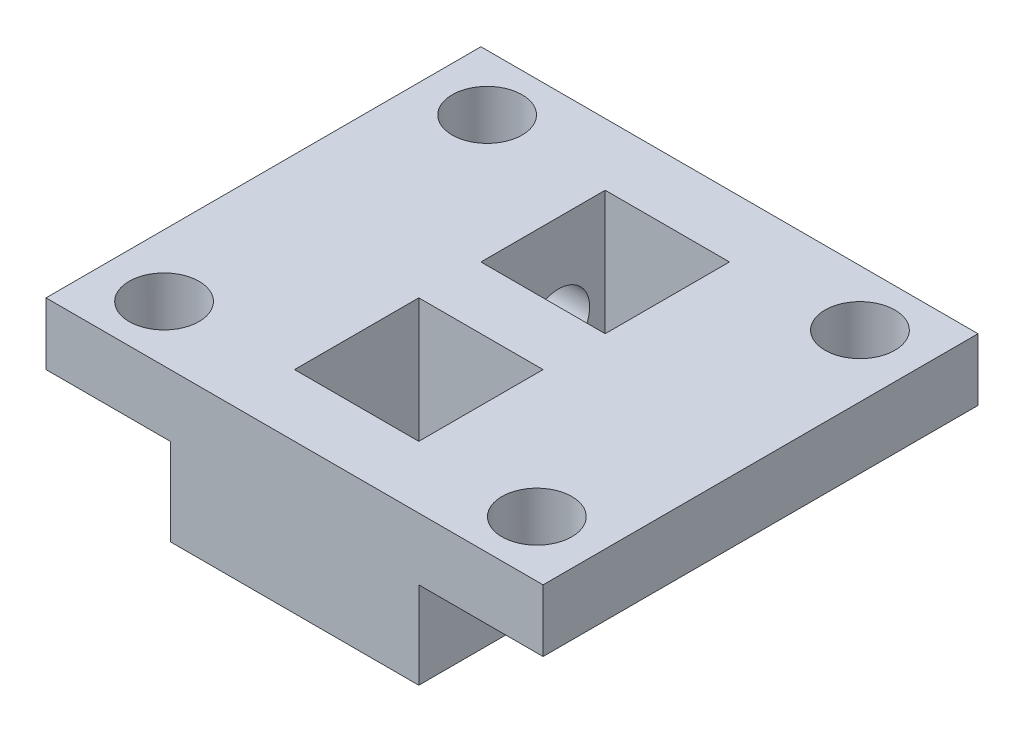
ISO-10303-21;
HEADER;
FILE_DESCRIPTION(('STEP AP214'),'2;1');
FILE_NAME('part.step','',(''),(''),'','','');
FILE_SCHEMA(('AUTOMOTIVE_DESIGN { 1 0 10303 214 1 1 1 1 }'));
ENDSEC;
DATA;
#1=APPLICATION_CONTEXT('core data for automotive mechanical design processes');
#2=APPLICATION_PROTOCOL_DEFINITION('international standard','automotive_design',2000,#1);
#3=PRODUCT_CONTEXT('',#1,'mechanical');
#4=PRODUCT('Part','Part','',(#3));
#5=PRODUCT_RELATED_PRODUCT_CATEGORY('part','',(#4));
#6=PRODUCT_DEFINITION_FORMATION('','',#4);
#7=PRODUCT_DEFINITION_CONTEXT('part definition',#1,'design');
#8=PRODUCT_DEFINITION('design','',#6,#7);
#9=PRODUCT_DEFINITION_SHAPE('','',#8);
#10=(LENGTH_UNIT() NAMED_UNIT(*) SI_UNIT(.MILLI.,.METRE.));
#11=(NAMED_UNIT(*) PLANE_ANGLE_UNIT() SI_UNIT($,.RADIAN.));
#12=(NAMED_UNIT(*) SI_UNIT($,.STERADIAN.) SOLID_ANGLE_UNIT());
#13=UNCERTAINTY_MEASURE_WITH_UNIT(LENGTH_MEASURE(1.E-05),#10,'distance_accuracy_value','');
#14=(GEOMETRIC_REPRESENTATION_CONTEXT(3) GLOBAL_UNCERTAINTY_ASSIGNED_CONTEXT((#13)) GLOBAL_UNIT_ASSIGNED_CONTEXT((#10,
#11,#12)) REPRESENTATION_CONTEXT('',''));
#15=CARTESIAN_POINT('',(0.,0.,0.));
#16=DIRECTION('',(0.,0.,1.));
#17=DIRECTION('',(1.,0.,0.));
#18=AXIS2_PLACEMENT_3D('',#15,#16,#17);
#19=CARTESIAN_POINT('',(6.35,0.,11.1125));
#20=DIRECTION('',(0.,-1.,0.));
#21=DIRECTION('',(1.,0.,0.));
#22=AXIS2_PLACEMENT_3D('',#19,#20,#21);
#23=PLANE('',#22);
#24=DIRECTION('',(-1.,0.,0.));
#25=VECTOR('',#24,1.);
#26=CARTESIAN_POINT('',(6.35,0.,0.));
#27=LINE('',#26,#25);
#28=CARTESIAN_POINT('',(6.35,0.,0.));
#29=VERTEX_POINT('',#28);
#30=CARTESIAN_POINT('',(-6.35,0.,0.));
#31=VERTEX_POINT('',#30);
#32=EDGE_CURVE('E279',#29,#31,#27,.T.);
#33=ORIENTED_EDGE('',*,*,#32,.F.);
#34=DIRECTION('',(0.,0.,-1.));
#35=VECTOR('',#34,1.);
#36=CARTESIAN_POINT('',(6.35,0.,11.1125));
#37=LINE('',#36,#35);
#38=CARTESIAN_POINT('',(6.35,0.,22.225));
#39=VERTEX_POINT('',#38);
#40=EDGE_CURVE('E12',#39,#29,#37,.T.);
#41=ORIENTED_EDGE('',*,*,#40,.F.);
#42=DIRECTION('',(-1.,0.,0.));
#43=VECTOR('',#42,1.);
#44=CARTESIAN_POINT('',(6.35,0.,22.225));
#45=LINE('',#44,#43);
#46=CARTESIAN_POINT('',(-6.35,0.,22.225));
#47=VERTEX_POINT('',#46);
#48=EDGE_CURVE('E205',#39,#47,#45,.T.);
#49=ORIENTED_EDGE('',*,*,#48,.T.);
#50=DIRECTION('',(0.,0.,-1.));
#51=VECTOR('',#50,1.);
#52=CARTESIAN_POINT('',(-6.35,0.,11.1125));
#53=LINE('',#52,#51);
#54=EDGE_CURVE('E276',#47,#31,#53,.T.);
#55=ORIENTED_EDGE('',*,*,#54,.T.);
#56=EDGE_LOOP('',(#33,#41,#49,#55));
#57=FACE_BOUND('',#56,.T.);
#58=ADVANCED_FACE('F35',(#57),#23,.T.);
#59=CARTESIAN_POINT('',(6.35,4.445,11.1125));
#60=DIRECTION('',(1.,0.,0.));
#61=DIRECTION('',(0.,1.,0.));
#62=AXIS2_PLACEMENT_3D('',#59,#60,#61);
#63=PLANE('',#62);
#64=DIRECTION('',(0.,-1.,0.));
#65=VECTOR('',#64,1.);
#66=CARTESIAN_POINT('',(6.35,4.445,0.));
#67=LINE('',#66,#65);
#68=CARTESIAN_POINT('',(6.35,4.445,0.));
#69=VERTEX_POINT('',#68);
#70=EDGE_CURVE('E299',#69,#29,#67,.T.);
#71=ORIENTED_EDGE('',*,*,#70,.F.);
#72=DIRECTION('',(0.,0.,-1.));
#73=VECTOR('',#72,1.);
#74=CARTESIAN_POINT('',(6.35,4.445,11.1125));
#75=LINE('',#74,#73);
#76=CARTESIAN_POINT('',(6.35,4.445,22.225));
#77=VERTEX_POINT('',#76);
#78=EDGE_CURVE('E43',#77,#69,#75,.T.);
#79=ORIENTED_EDGE('',*,*,#78,.F.);
#80=DIRECTION('',(0.,-1.,0.));
#81=VECTOR('',#80,1.);
#82=CARTESIAN_POINT('',(6.35,4.445,22.225));
#83=LINE('',#82,#81);
#84=EDGE_CURVE('E217',#77,#39,#83,.T.);
#85=ORIENTED_EDGE('',*,*,#84,.T.);
#86=ORIENTED_EDGE('',*,*,#40,.T.);
#87=EDGE_LOOP('',(#71,#79,#85,#86));
#88=FACE_BOUND('',#87,.T.);
#89=ADVANCED_FACE('F337',(#88),#63,.T.);
#90=CARTESIAN_POINT('',(12.7,4.445,11.1125));
#91=DIRECTION('',(0.,-1.,0.));
#92=DIRECTION('',(1.,0.,0.));
#93=AXIS2_PLACEMENT_3D('',#90,#91,#92);
#94=PLANE('',#93);
#95=CARTESIAN_POINT('',(9.525,4.445,2.8575));
#96=DIRECTION('',(0.,-1.,0.));
#97=DIRECTION('',(1.,0.,0.));
#98=AXIS2_PLACEMENT_3D('',#95,#96,#97);
#99=CIRCLE('',#98,1.7859375);
#100=CARTESIAN_POINT('',(11.3109375,4.445,2.8575));
#101=VERTEX_POINT('',#100);
#102=EDGE_CURVE('E221',#101,#101,#99,.T.);
#103=ORIENTED_EDGE('',*,*,#102,.F.);
#104=EDGE_LOOP('',(#103));
#105=FACE_BOUND('',#104,.T.);
#106=DIRECTION('',(-1.,0.,0.));
#107=VECTOR('',#106,1.);
#108=CARTESIAN_POINT('',(12.7,4.445,0.));
#109=LINE('',#108,#107);
#110=CARTESIAN_POINT('',(12.7,4.445,0.));
#111=VERTEX_POINT('',#110);
#112=EDGE_CURVE('E296',#111,#69,#109,.T.);
#113=ORIENTED_EDGE('',*,*,#112,.F.);
#114=DIRECTION('',(0.,0.,-1.));
#115=VECTOR('',#114,1.);
#116=CARTESIAN_POINT('',(12.7,4.445,11.1125));
#117=LINE('',#116,#115);
#118=CARTESIAN_POINT('',(12.7,4.445,22.225));
#119=VERTEX_POINT('',#118);
#120=EDGE_CURVE('E302',#119,#111,#117,.T.);
#121=ORIENTED_EDGE('',*,*,#120,.F.);
#122=DIRECTION('',(-1.,0.,0.));
#123=VECTOR('',#122,1.);
#124=CARTESIAN_POINT('',(12.7,4.445,22.225));
#125=LINE('',#124,#123);
#126=EDGE_CURVE('E214',#119,#77,#125,.T.);
#127=ORIENTED_EDGE('',*,*,#126,.T.);
#128=ORIENTED_EDGE('',*,*,#78,.T.);
#129=EDGE_LOOP('',(#113,#121,#127,#128));
#130=FACE_BOUND('',#129,.T.);
#131=CARTESIAN_POINT('',(9.525,4.445,19.3675));
#132=DIRECTION('',(0.,1.,0.));
#133=DIRECTION('',(1.,0.,0.));
#134=AXIS2_PLACEMENT_3D('',#131,#132,#133);
#135=CIRCLE('',#134,1.7859375);
#136=CARTESIAN_POINT('',(11.3109375,4.445,19.3675));
#137=VERTEX_POINT('',#136);
#138=EDGE_CURVE('E347',#137,#137,#135,.T.);
#139=ORIENTED_EDGE('',*,*,#138,.T.);
#140=EDGE_LOOP('',(#139));
#141=FACE_BOUND('',#140,.T.);
#142=ADVANCED_FACE('F333',(#105,#130,#141),#94,.T.);
#143=CARTESIAN_POINT('',(12.7,7.62,11.1125));
#144=DIRECTION('',(1.,0.,0.));
#145=DIRECTION('',(0.,0.,-1.));
#146=AXIS2_PLACEMENT_3D('',#143,#144,#145);
#147=PLANE('',#146);
#148=DIRECTION('',(0.,-1.,0.));
#149=VECTOR('',#148,1.);
#150=CARTESIAN_POINT('',(12.7,7.62,0.));
#151=LINE('',#150,#149);
#152=CARTESIAN_POINT('',(12.7,7.62,0.));
#153=VERTEX_POINT('',#152);
#154=EDGE_CURVE('E293',#153,#111,#151,.T.);
#155=ORIENTED_EDGE('',*,*,#154,.F.);
#156=DIRECTION('',(0.,0.,-1.));
#157=VECTOR('',#156,1.);
#158=CARTESIAN_POINT('',(12.7,7.62,11.1125));
#159=LINE('',#158,#157);
#160=CARTESIAN_POINT('',(12.7,7.62,22.225));
#161=VERTEX_POINT('',#160);
#162=EDGE_CURVE('E38',#161,#153,#159,.T.);
#163=ORIENTED_EDGE('',*,*,#162,.F.);
#164=DIRECTION('',(0.,-1.,0.));
#165=VECTOR('',#164,1.);
#166=CARTESIAN_POINT('',(12.7,7.62,22.225));
#167=LINE('',#166,#165);
#168=EDGE_CURVE('E211',#161,#119,#167,.T.);
#169=ORIENTED_EDGE('',*,*,#168,.T.);
#170=ORIENTED_EDGE('',*,*,#120,.T.);
#171=EDGE_LOOP('',(#155,#163,#169,#170));
#172=FACE_BOUND('',#171,.T.);
#173=ADVANCED_FACE('F311',(#172),#147,.T.);
#174=CARTESIAN_POINT('',(0.,7.62,11.1125));
#175=DIRECTION('',(0.,1.,0.));
#176=DIRECTION('',(0.,0.,1.));
#177=AXIS2_PLACEMENT_3D('',#174,#175,#176);
#178=PLANE('',#177);
#179=CARTESIAN_POINT('',(9.525,7.62,2.8575));
#180=DIRECTION('',(0.,1.,0.));
#181=DIRECTION('',(0.,0.,1.));
#182=AXIS2_PLACEMENT_3D('',#179,#180,#181);
#183=CIRCLE('',#182,1.7859375);
#184=CARTESIAN_POINT('',(9.525,7.62,4.6434375));
#185=VERTEX_POINT('',#184);
#186=EDGE_CURVE('E224',#185,#185,#183,.F.);
#187=ORIENTED_EDGE('',*,*,#186,.T.);
#188=EDGE_LOOP('',(#187));
#189=FACE_BOUND('',#188,.T.);
#190=CARTESIAN_POINT('',(-9.525,7.62,2.8575));
#191=DIRECTION('',(0.,1.,0.));
#192=DIRECTION('',(0.,0.,1.));
#193=AXIS2_PLACEMENT_3D('',#190,#191,#192);
#194=CIRCLE('',#193,1.7859375);
#195=CARTESIAN_POINT('',(-9.525,7.62,4.64343749999999));
#196=VERTEX_POINT('',#195);
#197=EDGE_CURVE('E220',#196,#196,#194,.F.);
#198=ORIENTED_EDGE('',*,*,#197,.T.);
#199=EDGE_LOOP('',(#198));
#200=FACE_BOUND('',#199,.T.);
#201=DIRECTION('',(0.,0.,-1.));
#202=VECTOR('',#201,1.);
#203=CARTESIAN_POINT('',(3.175,7.62,9.525));
#204=LINE('',#203,#202);
#205=CARTESIAN_POINT('',(3.175,7.62,9.525));
#206=VERTEX_POINT('',#205);
#207=CARTESIAN_POINT('',(3.175,7.62,3.175));
#208=VERTEX_POINT('',#207);
#209=EDGE_CURVE('E241',#206,#208,#204,.T.);
#210=ORIENTED_EDGE('',*,*,#209,.F.);
#211=DIRECTION('',(1.,0.,0.));
#212=VECTOR('',#211,1.);
#213=CARTESIAN_POINT('',(-3.175,7.62,9.525));
#214=LINE('',#213,#212);
#215=CARTESIAN_POINT('',(-3.175,7.62,9.525));
#216=VERTEX_POINT('',#215);
#217=EDGE_CURVE('E234',#216,#206,#214,.T.);
#218=ORIENTED_EDGE('',*,*,#217,.F.);
#219=DIRECTION('',(0.,0.,1.));
#220=VECTOR('',#219,1.);
#221=CARTESIAN_POINT('',(-3.175,7.62,3.175));
#222=LINE('',#221,#220);
#223=CARTESIAN_POINT('',(-3.175,7.62,3.175));
#224=VERTEX_POINT('',#223);
#225=EDGE_CURVE('E235',#224,#216,#222,.T.);
#226=ORIENTED_EDGE('',*,*,#225,.F.);
#227=DIRECTION('',(-1.,0.,0.));
#228=VECTOR('',#227,1.);
#229=CARTESIAN_POINT('',(3.175,7.62,3.175));
#230=LINE('',#229,#228);
#231=EDGE_CURVE('E238',#208,#224,#230,.T.);
#232=ORIENTED_EDGE('',*,*,#231,.F.);
#233=EDGE_LOOP('',(#210,#218,#226,#232));
#234=FACE_BOUND('',#233,.T.);
#235=DIRECTION('',(1.,0.,0.));
#236=VECTOR('',#235,1.);
#237=CARTESIAN_POINT('',(0.,7.62,0.));
#238=LINE('',#237,#236);
#239=CARTESIAN_POINT('',(-12.7,7.62,0.));
#240=VERTEX_POINT('',#239);
#241=EDGE_CURVE('E290',#240,#153,#238,.T.);
#242=ORIENTED_EDGE('',*,*,#241,.F.);
#243=DIRECTION('',(0.,0.,-1.));
#244=VECTOR('',#243,1.);
#245=CARTESIAN_POINT('',(-12.7,7.62,11.1125));
#246=LINE('',#245,#244);
#247=CARTESIAN_POINT('',(-12.7,7.62,22.225));
#248=VERTEX_POINT('',#247);
#249=EDGE_CURVE('E275',#248,#240,#246,.T.);
#250=ORIENTED_EDGE('',*,*,#249,.F.);
#251=DIRECTION('',(1.,0.,0.));
#252=VECTOR('',#251,1.);
#253=CARTESIAN_POINT('',(0.,7.62,22.225));
#254=LINE('',#253,#252);
#255=EDGE_CURVE('E208',#248,#161,#254,.T.);
#256=ORIENTED_EDGE('',*,*,#255,.T.);
#257=ORIENTED_EDGE('',*,*,#162,.T.);
#258=EDGE_LOOP('',(#242,#250,#256,#257));
#259=FACE_BOUND('',#258,.T.);
#260=CARTESIAN_POINT('',(9.525,7.62,19.3675));
#261=DIRECTION('',(0.,-1.,0.));
#262=DIRECTION('',(0.,0.,-1.));
#263=AXIS2_PLACEMENT_3D('',#260,#261,#262);
#264=CIRCLE('',#263,1.7859375);
#265=CARTESIAN_POINT('',(9.525,7.62,17.5815625));
#266=VERTEX_POINT('',#265);
#267=EDGE_CURVE('E352',#266,#266,#264,.F.);
#268=ORIENTED_EDGE('',*,*,#267,.F.);
#269=EDGE_LOOP('',(#268));
#270=FACE_BOUND('',#269,.T.);
#271=CARTESIAN_POINT('',(-9.525,7.62,19.3675));
#272=DIRECTION('',(0.,-1.,0.));
#273=DIRECTION('',(0.,0.,-1.));
#274=AXIS2_PLACEMENT_3D('',#271,#272,#273);
#275=CIRCLE('',#274,1.7859375);
#276=CARTESIAN_POINT('',(-9.525,7.62,17.5815625));
#277=VERTEX_POINT('',#276);
#278=EDGE_CURVE('E355',#277,#277,#275,.F.);
#279=ORIENTED_EDGE('',*,*,#278,.F.);
#280=EDGE_LOOP('',(#279));
#281=FACE_BOUND('',#280,.T.);
#282=DIRECTION('',(0.,0.,1.));
#283=VECTOR('',#282,1.);
#284=CARTESIAN_POINT('',(3.175,7.62,12.7));
#285=LINE('',#284,#283);
#286=CARTESIAN_POINT('',(3.175,7.62,12.7));
#287=VERTEX_POINT('',#286);
#288=CARTESIAN_POINT('',(3.175,7.62,19.05));
#289=VERTEX_POINT('',#288);
#290=EDGE_CURVE('E361',#287,#289,#285,.T.);
#291=ORIENTED_EDGE('',*,*,#290,.T.);
#292=DIRECTION('',(-1.,0.,0.));
#293=VECTOR('',#292,1.);
#294=CARTESIAN_POINT('',(3.175,7.62,19.05));
#295=LINE('',#294,#293);
#296=CARTESIAN_POINT('',(-3.175,7.62,19.05));
#297=VERTEX_POINT('',#296);
#298=EDGE_CURVE('E165',#289,#297,#295,.T.);
#299=ORIENTED_EDGE('',*,*,#298,.T.);
#300=DIRECTION('',(0.,0.,-1.));
#301=VECTOR('',#300,1.);
#302=CARTESIAN_POINT('',(-3.175,7.62,19.05));
#303=LINE('',#302,#301);
#304=CARTESIAN_POINT('',(-3.175,7.62,12.7));
#305=VERTEX_POINT('',#304);
#306=EDGE_CURVE('E177',#297,#305,#303,.T.);
#307=ORIENTED_EDGE('',*,*,#306,.T.);
#308=DIRECTION('',(1.,0.,0.));
#309=VECTOR('',#308,1.);
#310=CARTESIAN_POINT('',(-3.175,7.62,12.7));
#311=LINE('',#310,#309);
#312=EDGE_CURVE('E349',#305,#287,#311,.T.);
#313=ORIENTED_EDGE('',*,*,#312,.T.);
#314=EDGE_LOOP('',(#291,#299,#307,#313));
#315=FACE_BOUND('',#314,.T.);
#316=ADVANCED_FACE('F307',(#189,#200,#234,#259,#270,#281,#315),#178,.T.);
#317=CARTESIAN_POINT('',(0.,0.,0.));
#318=DIRECTION('',(0.,0.,-1.));
#319=DIRECTION('',(-1.,0.,0.));
#320=AXIS2_PLACEMENT_3D('',#317,#318,#319);
#321=PLANE('',#320);
#322=ORIENTED_EDGE('',*,*,#32,.T.);
#323=DIRECTION('',(0.,-1.,0.));
#324=VECTOR('',#323,1.);
#325=CARTESIAN_POINT('',(-6.35,4.445,0.));
#326=LINE('',#325,#324);
#327=CARTESIAN_POINT('',(-6.35,4.445,0.));
#328=VERTEX_POINT('',#327);
#329=EDGE_CURVE('E272',#328,#31,#326,.T.);
#330=ORIENTED_EDGE('',*,*,#329,.F.);
#331=DIRECTION('',(1.,0.,0.));
#332=VECTOR('',#331,1.);
#333=CARTESIAN_POINT('',(-12.7,4.445,0.));
#334=LINE('',#333,#332);
#335=CARTESIAN_POINT('',(-12.7,4.445,0.));
#336=VERTEX_POINT('',#335);
#337=EDGE_CURVE('E269',#336,#328,#334,.T.);
#338=ORIENTED_EDGE('',*,*,#337,.F.);
#339=DIRECTION('',(0.,-1.,0.));
#340=VECTOR('',#339,1.);
#341=CARTESIAN_POINT('',(-12.7,7.62,0.));
#342=LINE('',#341,#340);
#343=EDGE_CURVE('E267',#240,#336,#342,.T.);
#344=ORIENTED_EDGE('',*,*,#343,.F.);
#345=ORIENTED_EDGE('',*,*,#241,.T.);
#346=ORIENTED_EDGE('',*,*,#154,.T.);
#347=ORIENTED_EDGE('',*,*,#112,.T.);
#348=ORIENTED_EDGE('',*,*,#70,.T.);
#349=EDGE_LOOP('',(#322,#330,#338,#344,#345,#346,#347,#348));
#350=FACE_BOUND('',#349,.T.);
#351=ADVANCED_FACE('F314',(#350),#321,.T.);
#352=CARTESIAN_POINT('',(-6.35,4.445,11.1125));
#353=DIRECTION('',(-1.,0.,0.));
#354=DIRECTION('',(0.,1.,0.));
#355=AXIS2_PLACEMENT_3D('',#352,#353,#354);
#356=PLANE('',#355);
#357=DIRECTION('',(0.,0.,-1.));
#358=VECTOR('',#357,1.);
#359=CARTESIAN_POINT('',(-6.35,4.445,11.1125));
#360=LINE('',#359,#358);
#361=CARTESIAN_POINT('',(-6.35,4.445,16.66875));
#362=VERTEX_POINT('',#361);
#363=CARTESIAN_POINT('',(-6.35,4.445,5.55625));
#364=VERTEX_POINT('',#363);
#365=EDGE_CURVE('E280',#362,#364,#360,.T.);
#366=ORIENTED_EDGE('',*,*,#365,.T.);
#367=CARTESIAN_POINT('',(-6.35,2.8575,5.55625));
#368=DIRECTION('',(-1.,0.,0.));
#369=DIRECTION('',(0.,-1.,0.));
#370=AXIS2_PLACEMENT_3D('',#367,#368,#369);
#371=CIRCLE('',#370,1.5875);
#372=EDGE_CURVE('E49',#364,#364,#371,.T.);
#373=ORIENTED_EDGE('',*,*,#372,.F.);
#374=EDGE_CURVE('E283',#364,#328,#360,.T.);
#375=ORIENTED_EDGE('',*,*,#374,.T.);
#376=ORIENTED_EDGE('',*,*,#329,.T.);
#377=ORIENTED_EDGE('',*,*,#54,.F.);
#378=DIRECTION('',(0.,-1.,0.));
#379=VECTOR('',#378,1.);
#380=CARTESIAN_POINT('',(-6.35,4.445,22.225));
#381=LINE('',#380,#379);
#382=CARTESIAN_POINT('',(-6.35,4.445,22.225));
#383=VERTEX_POINT('',#382);
#384=EDGE_CURVE('E200',#383,#47,#381,.T.);
#385=ORIENTED_EDGE('',*,*,#384,.F.);
#386=DIRECTION('',(0.,0.,1.));
#387=VECTOR('',#386,1.);
#388=CARTESIAN_POINT('',(-6.35,4.445,11.1125));
#389=LINE('',#388,#387);
#390=EDGE_CURVE('E203',#362,#383,#389,.T.);
#391=ORIENTED_EDGE('',*,*,#390,.F.);
#392=CARTESIAN_POINT('',(-6.35,2.8575,16.66875));
#393=DIRECTION('',(1.,0.,0.));
#394=DIRECTION('',(0.,-1.,0.));
#395=AXIS2_PLACEMENT_3D('',#392,#393,#394);
#396=CIRCLE('',#395,1.5875);
#397=EDGE_CURVE('E344',#362,#362,#396,.T.);
#398=ORIENTED_EDGE('',*,*,#397,.T.);
#399=EDGE_LOOP('',(#366,#373,#375,#376,#377,#385,#391,#398));
#400=FACE_BOUND('',#399,.T.);
#401=ADVANCED_FACE('F341',(#400),#356,.T.);
#402=CARTESIAN_POINT('',(-12.7,4.445,11.1125));
#403=DIRECTION('',(0.,-1.,0.));
#404=DIRECTION('',(-1.,0.,0.));
#405=AXIS2_PLACEMENT_3D('',#402,#403,#404);
#406=PLANE('',#405);
#407=CARTESIAN_POINT('',(-9.525,4.44499999999999,2.8575));
#408=DIRECTION('',(0.,-1.,0.));
#409=DIRECTION('',(1.,0.,0.));
#410=AXIS2_PLACEMENT_3D('',#407,#408,#409);
#411=CIRCLE('',#410,1.7859375);
#412=CARTESIAN_POINT('',(-7.7390625,4.44499999999999,2.8575));
#413=VERTEX_POINT('',#412);
#414=EDGE_CURVE('E227',#413,#413,#411,.T.);
#415=ORIENTED_EDGE('',*,*,#414,.F.);
#416=EDGE_LOOP('',(#415));
#417=FACE_BOUND('',#416,.T.);
#418=ORIENTED_EDGE('',*,*,#337,.T.);
#419=ORIENTED_EDGE('',*,*,#374,.F.);
#420=ORIENTED_EDGE('',*,*,#365,.F.);
#421=ORIENTED_EDGE('',*,*,#390,.T.);
#422=DIRECTION('',(1.,0.,0.));
#423=VECTOR('',#422,1.);
#424=CARTESIAN_POINT('',(-12.7,4.445,22.225));
#425=LINE('',#424,#423);
#426=CARTESIAN_POINT('',(-12.7,4.445,22.225));
#427=VERTEX_POINT('',#426);
#428=EDGE_CURVE('E197',#427,#383,#425,.T.);
#429=ORIENTED_EDGE('',*,*,#428,.F.);
#430=DIRECTION('',(0.,0.,-1.));
#431=VECTOR('',#430,1.);
#432=CARTESIAN_POINT('',(-12.7,4.445,11.1125));
#433=LINE('',#432,#431);
#434=EDGE_CURVE('E284',#427,#336,#433,.T.);
#435=ORIENTED_EDGE('',*,*,#434,.T.);
#436=EDGE_LOOP('',(#418,#419,#420,#421,#429,#435));
#437=FACE_BOUND('',#436,.T.);
#438=CARTESIAN_POINT('',(-9.525,4.44499999999999,19.3675));
#439=DIRECTION('',(0.,1.,0.));
#440=DIRECTION('',(1.,0.,0.));
#441=AXIS2_PLACEMENT_3D('',#438,#439,#440);
#442=CIRCLE('',#441,1.7859375);
#443=CARTESIAN_POINT('',(-7.7390625,4.44499999999999,19.3675));
#444=VERTEX_POINT('',#443);
#445=EDGE_CURVE('E460',#444,#444,#442,.T.);
#446=ORIENTED_EDGE('',*,*,#445,.T.);
#447=EDGE_LOOP('',(#446));
#448=FACE_BOUND('',#447,.T.);
#449=ADVANCED_FACE('F322',(#417,#437,#448),#406,.T.);
#450=CARTESIAN_POINT('',(-12.7,7.62,11.1125));
#451=DIRECTION('',(-1.,0.,0.));
#452=DIRECTION('',(0.,0.,-1.));
#453=AXIS2_PLACEMENT_3D('',#450,#451,#452);
#454=PLANE('',#453);
#455=ORIENTED_EDGE('',*,*,#343,.T.);
#456=ORIENTED_EDGE('',*,*,#434,.F.);
#457=DIRECTION('',(0.,-1.,0.));
#458=VECTOR('',#457,1.);
#459=CARTESIAN_POINT('',(-12.7,7.62,22.225));
#460=LINE('',#459,#458);
#461=EDGE_CURVE('E194',#248,#427,#460,.T.);
#462=ORIENTED_EDGE('',*,*,#461,.F.);
#463=ORIENTED_EDGE('',*,*,#249,.T.);
#464=EDGE_LOOP('',(#455,#456,#462,#463));
#465=FACE_BOUND('',#464,.T.);
#466=ADVANCED_FACE('F318',(#465),#454,.T.);
#467=CARTESIAN_POINT('',(6.35,1.27,11.1125));
#468=DIRECTION('',(0.,-1.,0.));
#469=DIRECTION('',(1.,0.,0.));
#470=AXIS2_PLACEMENT_3D('',#467,#468,#469);
#471=PLANE('',#470);
#472=DIRECTION('',(1.,0.,0.));
#473=VECTOR('',#472,1.);
#474=CARTESIAN_POINT('',(-3.175,1.27,9.525));
#475=LINE('',#474,#473);
#476=CARTESIAN_POINT('',(-3.175,1.27,9.525));
#477=VERTEX_POINT('',#476);
#478=CARTESIAN_POINT('',(3.175,1.27,9.525));
#479=VERTEX_POINT('',#478);
#480=EDGE_CURVE('E249',#477,#479,#475,.T.);
#481=ORIENTED_EDGE('',*,*,#480,.T.);
#482=DIRECTION('',(0.,0.,-1.));
#483=VECTOR('',#482,1.);
#484=CARTESIAN_POINT('',(3.175,1.27,9.525));
#485=LINE('',#484,#483);
#486=CARTESIAN_POINT('',(3.175,1.27,3.175));
#487=VERTEX_POINT('',#486);
#488=EDGE_CURVE('E237',#479,#487,#485,.T.);
#489=ORIENTED_EDGE('',*,*,#488,.T.);
#490=DIRECTION('',(-1.,0.,0.));
#491=VECTOR('',#490,1.);
#492=CARTESIAN_POINT('',(3.175,1.27,3.175));
#493=LINE('',#492,#491);
#494=CARTESIAN_POINT('',(-3.175,1.27,3.175));
#495=VERTEX_POINT('',#494);
#496=EDGE_CURVE('E258',#487,#495,#493,.T.);
#497=ORIENTED_EDGE('',*,*,#496,.T.);
#498=DIRECTION('',(0.,0.,1.));
#499=VECTOR('',#498,1.);
#500=CARTESIAN_POINT('',(-3.175,1.27,3.175));
#501=LINE('',#500,#499);
#502=CARTESIAN_POINT('',(-3.175,1.27,5.55625));
#503=VERTEX_POINT('',#502);
#504=EDGE_CURVE('E254',#495,#503,#501,.T.);
#505=ORIENTED_EDGE('',*,*,#504,.T.);
#506=EDGE_CURVE('E257',#503,#477,#501,.T.);
#507=ORIENTED_EDGE('',*,*,#506,.T.);
#508=EDGE_LOOP('',(#481,#489,#497,#505,#507));
#509=FACE_BOUND('',#508,.T.);
#510=ADVANCED_FACE('F395',(#509),#471,.F.);
#511=CARTESIAN_POINT('',(3.175,-8.98025612106916,9.525));
#512=DIRECTION('',(1.,0.,0.));
#513=DIRECTION('',(0.,0.,-1.));
#514=AXIS2_PLACEMENT_3D('',#511,#512,#513);
#515=PLANE('',#514);
#516=DIRECTION('',(0.,1.,0.));
#517=VECTOR('',#516,1.);
#518=CARTESIAN_POINT('',(3.175,-8.98025612106916,9.525));
#519=LINE('',#518,#517);
#520=EDGE_CURVE('E252',#479,#206,#519,.T.);
#521=ORIENTED_EDGE('',*,*,#520,.T.);
#522=ORIENTED_EDGE('',*,*,#209,.T.);
#523=DIRECTION('',(0.,1.,0.));
#524=VECTOR('',#523,1.);
#525=CARTESIAN_POINT('',(3.175,-8.98025612106916,3.175));
#526=LINE('',#525,#524);
#527=EDGE_CURVE('E248',#487,#208,#526,.T.);
#528=ORIENTED_EDGE('',*,*,#527,.F.);
#529=ORIENTED_EDGE('',*,*,#488,.F.);
#530=EDGE_LOOP('',(#521,#522,#528,#529));
#531=FACE_BOUND('',#530,.T.);
#532=ADVANCED_FACE('F403',(#531),#515,.F.);
#533=CARTESIAN_POINT('',(3.175,-8.98025612106916,3.175));
#534=DIRECTION('',(0.,0.,-1.));
#535=DIRECTION('',(-1.,0.,0.));
#536=AXIS2_PLACEMENT_3D('',#533,#534,#535);
#537=PLANE('',#536);
#538=ORIENTED_EDGE('',*,*,#527,.T.);
#539=ORIENTED_EDGE('',*,*,#231,.T.);
#540=DIRECTION('',(0.,1.,0.));
#541=VECTOR('',#540,1.);
#542=CARTESIAN_POINT('',(-3.175,-8.98025612106916,3.175));
#543=LINE('',#542,#541);
#544=EDGE_CURVE('E261',#495,#224,#543,.T.);
#545=ORIENTED_EDGE('',*,*,#544,.F.);
#546=ORIENTED_EDGE('',*,*,#496,.F.);
#547=EDGE_LOOP('',(#538,#539,#545,#546));
#548=FACE_BOUND('',#547,.T.);
#549=ADVANCED_FACE('F407',(#548),#537,.F.);
#550=CARTESIAN_POINT('',(-3.175,-8.98025612106916,3.175));
#551=DIRECTION('',(-1.,0.,0.));
#552=DIRECTION('',(0.,0.,1.));
#553=AXIS2_PLACEMENT_3D('',#550,#551,#552);
#554=PLANE('',#553);
#555=ORIENTED_EDGE('',*,*,#506,.F.);
#556=CARTESIAN_POINT('',(-3.175,2.8575,5.55625));
#557=DIRECTION('',(-1.,0.,0.));
#558=DIRECTION('',(0.,0.,1.));
#559=AXIS2_PLACEMENT_3D('',#556,#557,#558);
#560=CIRCLE('',#559,1.5875);
#561=EDGE_CURVE('E54',#503,#503,#560,.F.);
#562=ORIENTED_EDGE('',*,*,#561,.F.);
#563=ORIENTED_EDGE('',*,*,#504,.F.);
#564=ORIENTED_EDGE('',*,*,#544,.T.);
#565=ORIENTED_EDGE('',*,*,#225,.T.);
#566=DIRECTION('',(0.,1.,0.));
#567=VECTOR('',#566,1.);
#568=CARTESIAN_POINT('',(-3.175,-8.98025612106916,9.525));
#569=LINE('',#568,#567);
#570=EDGE_CURVE('E253',#477,#216,#569,.T.);
#571=ORIENTED_EDGE('',*,*,#570,.F.);
#572=EDGE_LOOP('',(#555,#562,#563,#564,#565,#571));
#573=FACE_BOUND('',#572,.T.);
#574=ADVANCED_FACE('F411',(#573),#554,.F.);
#575=CARTESIAN_POINT('',(-3.175,-8.98025612106916,9.525));
#576=DIRECTION('',(0.,0.,1.));
#577=DIRECTION('',(1.,0.,0.));
#578=AXIS2_PLACEMENT_3D('',#575,#576,#577);
#579=PLANE('',#578);
#580=ORIENTED_EDGE('',*,*,#570,.T.);
#581=ORIENTED_EDGE('',*,*,#217,.T.);
#582=ORIENTED_EDGE('',*,*,#520,.F.);
#583=ORIENTED_EDGE('',*,*,#480,.F.);
#584=EDGE_LOOP('',(#580,#581,#582,#583));
#585=FACE_BOUND('',#584,.T.);
#586=ADVANCED_FACE('F415',(#585),#579,.F.);
#587=CARTESIAN_POINT('',(1.31512806053458,2.8575,5.55625));
#588=DIRECTION('',(-1.,0.,0.));
#589=DIRECTION('',(0.,-1.,0.));
#590=AXIS2_PLACEMENT_3D('',#587,#588,#589);
#591=CYLINDRICAL_SURFACE('',#590,1.5875);
#592=ORIENTED_EDGE('',*,*,#561,.T.);
#593=EDGE_LOOP('',(#592));
#594=FACE_BOUND('',#593,.T.);
#595=ORIENTED_EDGE('',*,*,#372,.T.);
#596=EDGE_LOOP('',(#595));
#597=FACE_BOUND('',#596,.T.);
#598=ADVANCED_FACE('F419',(#594,#597),#591,.F.);
#599=CARTESIAN_POINT('',(-9.525,7.621,2.8575));
#600=DIRECTION('',(0.,-1.,0.));
#601=DIRECTION('',(1.,0.,0.));
#602=AXIS2_PLACEMENT_3D('',#599,#600,#601);
#603=CYLINDRICAL_SURFACE('',#602,1.7859375);
#604=ORIENTED_EDGE('',*,*,#197,.F.);
#605=EDGE_LOOP('',(#604));
#606=FACE_BOUND('',#605,.T.);
#607=ORIENTED_EDGE('',*,*,#414,.T.);
#608=EDGE_LOOP('',(#607));
#609=FACE_BOUND('',#608,.T.);
#610=ADVANCED_FACE('F423',(#606,#609),#603,.F.);
#611=CARTESIAN_POINT('',(9.525,7.621,2.8575));
#612=DIRECTION('',(0.,-1.,0.));
#613=DIRECTION('',(1.,0.,0.));
#614=AXIS2_PLACEMENT_3D('',#611,#612,#613);
#615=CYLINDRICAL_SURFACE('',#614,1.7859375);
#616=ORIENTED_EDGE('',*,*,#186,.F.);
#617=EDGE_LOOP('',(#616));
#618=FACE_BOUND('',#617,.T.);
#619=ORIENTED_EDGE('',*,*,#102,.T.);
#620=EDGE_LOOP('',(#619));
#621=FACE_BOUND('',#620,.T.);
#622=ADVANCED_FACE('F426',(#618,#621),#615,.F.);
#623=CARTESIAN_POINT('',(0.,0.,22.225));
#624=DIRECTION('',(0.,0.,1.));
#625=DIRECTION('',(-1.,0.,0.));
#626=AXIS2_PLACEMENT_3D('',#623,#624,#625);
#627=PLANE('',#626);
#628=ORIENTED_EDGE('',*,*,#48,.F.);
#629=ORIENTED_EDGE('',*,*,#84,.F.);
#630=ORIENTED_EDGE('',*,*,#126,.F.);
#631=ORIENTED_EDGE('',*,*,#168,.F.);
#632=ORIENTED_EDGE('',*,*,#255,.F.);
#633=ORIENTED_EDGE('',*,*,#461,.T.);
#634=ORIENTED_EDGE('',*,*,#428,.T.);
#635=ORIENTED_EDGE('',*,*,#384,.T.);
#636=EDGE_LOOP('',(#628,#629,#630,#631,#632,#633,#634,#635));
#637=FACE_BOUND('',#636,.T.);
#638=ADVANCED_FACE('F329',(#637),#627,.T.);
#639=CARTESIAN_POINT('',(6.35,1.27,11.1125));
#640=DIRECTION('',(0.,-1.,0.));
#641=DIRECTION('',(1.,0.,0.));
#642=AXIS2_PLACEMENT_3D('',#639,#640,#641);
#643=PLANE('',#642);
#644=DIRECTION('',(1.,0.,0.));
#645=VECTOR('',#644,1.);
#646=CARTESIAN_POINT('',(-3.175,1.27,12.7));
#647=LINE('',#646,#645);
#648=CARTESIAN_POINT('',(-3.175,1.27,12.7));
#649=VERTEX_POINT('',#648);
#650=CARTESIAN_POINT('',(3.175,1.27,12.7));
#651=VERTEX_POINT('',#650);
#652=EDGE_CURVE('E191',#649,#651,#647,.T.);
#653=ORIENTED_EDGE('',*,*,#652,.F.);
#654=DIRECTION('',(0.,0.,-1.));
#655=VECTOR('',#654,1.);
#656=CARTESIAN_POINT('',(-3.175,1.27,19.05));
#657=LINE('',#656,#655);
#658=CARTESIAN_POINT('',(-3.175,1.27,16.66875));
#659=VERTEX_POINT('',#658);
#660=EDGE_CURVE('E185',#659,#649,#657,.T.);
#661=ORIENTED_EDGE('',*,*,#660,.F.);
#662=CARTESIAN_POINT('',(-3.175,1.27,19.05));
#663=VERTEX_POINT('',#662);
#664=EDGE_CURVE('E182',#663,#659,#657,.T.);
#665=ORIENTED_EDGE('',*,*,#664,.F.);
#666=DIRECTION('',(-1.,0.,0.));
#667=VECTOR('',#666,1.);
#668=CARTESIAN_POINT('',(3.175,1.27,19.05));
#669=LINE('',#668,#667);
#670=CARTESIAN_POINT('',(3.175,1.27,19.05));
#671=VERTEX_POINT('',#670);
#672=EDGE_CURVE('E162',#671,#663,#669,.T.);
#673=ORIENTED_EDGE('',*,*,#672,.F.);
#674=DIRECTION('',(0.,0.,1.));
#675=VECTOR('',#674,1.);
#676=CARTESIAN_POINT('',(3.175,1.27,12.7));
#677=LINE('',#676,#675);
#678=EDGE_CURVE('E169',#651,#671,#677,.T.);
#679=ORIENTED_EDGE('',*,*,#678,.F.);
#680=EDGE_LOOP('',(#653,#661,#665,#673,#679));
#681=FACE_BOUND('',#680,.T.);
#682=ADVANCED_FACE('F179',(#681),#643,.F.);
#683=CARTESIAN_POINT('',(3.175,-8.98025612106916,12.7));
#684=DIRECTION('',(1.,0.,0.));
#685=DIRECTION('',(0.,0.,1.));
#686=AXIS2_PLACEMENT_3D('',#683,#684,#685);
#687=PLANE('',#686);
#688=DIRECTION('',(0.,1.,0.));
#689=VECTOR('',#688,1.);
#690=CARTESIAN_POINT('',(3.175,-8.98025612106916,12.7));
#691=LINE('',#690,#689);
#692=EDGE_CURVE('E173',#651,#287,#691,.T.);
#693=ORIENTED_EDGE('',*,*,#692,.F.);
#694=ORIENTED_EDGE('',*,*,#678,.T.);
#695=DIRECTION('',(0.,1.,0.));
#696=VECTOR('',#695,1.);
#697=CARTESIAN_POINT('',(3.175,-8.98025612106916,19.05));
#698=LINE('',#697,#696);
#699=EDGE_CURVE('E158',#671,#289,#698,.T.);
#700=ORIENTED_EDGE('',*,*,#699,.T.);
#701=ORIENTED_EDGE('',*,*,#290,.F.);
#702=EDGE_LOOP('',(#693,#694,#700,#701));
#703=FACE_BOUND('',#702,.T.);
#704=ADVANCED_FACE('F172',(#703),#687,.F.);
#705=CARTESIAN_POINT('',(3.175,-8.98025612106916,19.05));
#706=DIRECTION('',(0.,0.,1.));
#707=DIRECTION('',(-1.,0.,0.));
#708=AXIS2_PLACEMENT_3D('',#705,#706,#707);
#709=PLANE('',#708);
#710=ORIENTED_EDGE('',*,*,#699,.F.);
#711=ORIENTED_EDGE('',*,*,#672,.T.);
#712=DIRECTION('',(0.,1.,0.));
#713=VECTOR('',#712,1.);
#714=CARTESIAN_POINT('',(-3.175,-8.98025612106916,19.05));
#715=LINE('',#714,#713);
#716=EDGE_CURVE('E183',#663,#297,#715,.T.);
#717=ORIENTED_EDGE('',*,*,#716,.T.);
#718=ORIENTED_EDGE('',*,*,#298,.F.);
#719=EDGE_LOOP('',(#710,#711,#717,#718));
#720=FACE_BOUND('',#719,.T.);
#721=ADVANCED_FACE('F160',(#720),#709,.F.);
#722=CARTESIAN_POINT('',(-3.175,-8.98025612106916,19.05));
#723=DIRECTION('',(-1.,0.,0.));
#724=DIRECTION('',(0.,0.,-1.));
#725=AXIS2_PLACEMENT_3D('',#722,#723,#724);
#726=PLANE('',#725);
#727=ORIENTED_EDGE('',*,*,#660,.T.);
#728=DIRECTION('',(0.,1.,0.));
#729=VECTOR('',#728,1.);
#730=CARTESIAN_POINT('',(-3.175,-8.98025612106916,12.7));
#731=LINE('',#730,#729);
#732=EDGE_CURVE('E190',#649,#305,#731,.T.);
#733=ORIENTED_EDGE('',*,*,#732,.T.);
#734=ORIENTED_EDGE('',*,*,#306,.F.);
#735=ORIENTED_EDGE('',*,*,#716,.F.);
#736=ORIENTED_EDGE('',*,*,#664,.T.);
#737=CARTESIAN_POINT('',(-3.175,2.8575,16.66875));
#738=DIRECTION('',(1.,0.,0.));
#739=DIRECTION('',(0.,0.,-1.));
#740=AXIS2_PLACEMENT_3D('',#737,#738,#739);
#741=CIRCLE('',#740,1.5875);
#742=EDGE_CURVE('E346',#659,#659,#741,.F.);
#743=ORIENTED_EDGE('',*,*,#742,.T.);
#744=EDGE_LOOP('',(#727,#733,#734,#735,#736,#743));
#745=FACE_BOUND('',#744,.T.);
#746=ADVANCED_FACE('F369',(#745),#726,.F.);
#747=CARTESIAN_POINT('',(-3.175,-8.98025612106916,12.7));
#748=DIRECTION('',(0.,0.,-1.));
#749=DIRECTION('',(1.,0.,0.));
#750=AXIS2_PLACEMENT_3D('',#747,#748,#749);
#751=PLANE('',#750);
#752=ORIENTED_EDGE('',*,*,#732,.F.);
#753=ORIENTED_EDGE('',*,*,#652,.T.);
#754=ORIENTED_EDGE('',*,*,#692,.T.);
#755=ORIENTED_EDGE('',*,*,#312,.F.);
#756=EDGE_LOOP('',(#752,#753,#754,#755));
#757=FACE_BOUND('',#756,.T.);
#758=ADVANCED_FACE('F365',(#757),#751,.F.);
#759=CARTESIAN_POINT('',(1.31512806053458,2.8575,16.66875));
#760=DIRECTION('',(-1.,0.,0.));
#761=DIRECTION('',(0.,-1.,0.));
#762=AXIS2_PLACEMENT_3D('',#759,#760,#761);
#763=CYLINDRICAL_SURFACE('',#762,1.5875);
#764=ORIENTED_EDGE('',*,*,#742,.F.);
#765=EDGE_LOOP('',(#764));
#766=FACE_BOUND('',#765,.T.);
#767=ORIENTED_EDGE('',*,*,#397,.F.);
#768=EDGE_LOOP('',(#767));
#769=FACE_BOUND('',#768,.T.);
#770=ADVANCED_FACE('F443',(#766,#769),#763,.F.);
#771=CARTESIAN_POINT('',(-9.525,7.621,19.3675));
#772=DIRECTION('',(0.,-1.,0.));
#773=DIRECTION('',(1.,0.,0.));
#774=AXIS2_PLACEMENT_3D('',#771,#772,#773);
#775=CYLINDRICAL_SURFACE('',#774,1.7859375);
#776=ORIENTED_EDGE('',*,*,#278,.T.);
#777=EDGE_LOOP('',(#776));
#778=FACE_BOUND('',#777,.T.);
#779=ORIENTED_EDGE('',*,*,#445,.F.);
#780=EDGE_LOOP('',(#779));
#781=FACE_BOUND('',#780,.T.);
#782=ADVANCED_FACE('F446',(#778,#781),#775,.F.);
#783=CARTESIAN_POINT('',(9.525,7.621,19.3675));
#784=DIRECTION('',(0.,-1.,0.));
#785=DIRECTION('',(1.,0.,0.));
#786=AXIS2_PLACEMENT_3D('',#783,#784,#785);
#787=CYLINDRICAL_SURFACE('',#786,1.7859375);
#788=ORIENTED_EDGE('',*,*,#267,.T.);
#789=EDGE_LOOP('',(#788));
#790=FACE_BOUND('',#789,.T.);
#791=ORIENTED_EDGE('',*,*,#138,.F.);
#792=EDGE_LOOP('',(#791));
#793=FACE_BOUND('',#792,.T.);
#794=ADVANCED_FACE('F450',(#790,#793),#787,.F.);
#795=CLOSED_SHELL('',(#58,#89,#142,#173,#316,#351,#401,#449,#466,#510,#532,#549,#574,#586,#598,
#610,#622,#638,#682,#704,#721,#746,#758,#770,#782,#794));
#796=MANIFOLD_SOLID_BREP('B2',#795);
#797=ADVANCED_BREP_SHAPE_REPRESENTATION('',(#18,#796),#14);
#798=SHAPE_DEFINITION_REPRESENTATION(#9,#797);
ENDSEC;
END-ISO-10303-21;
